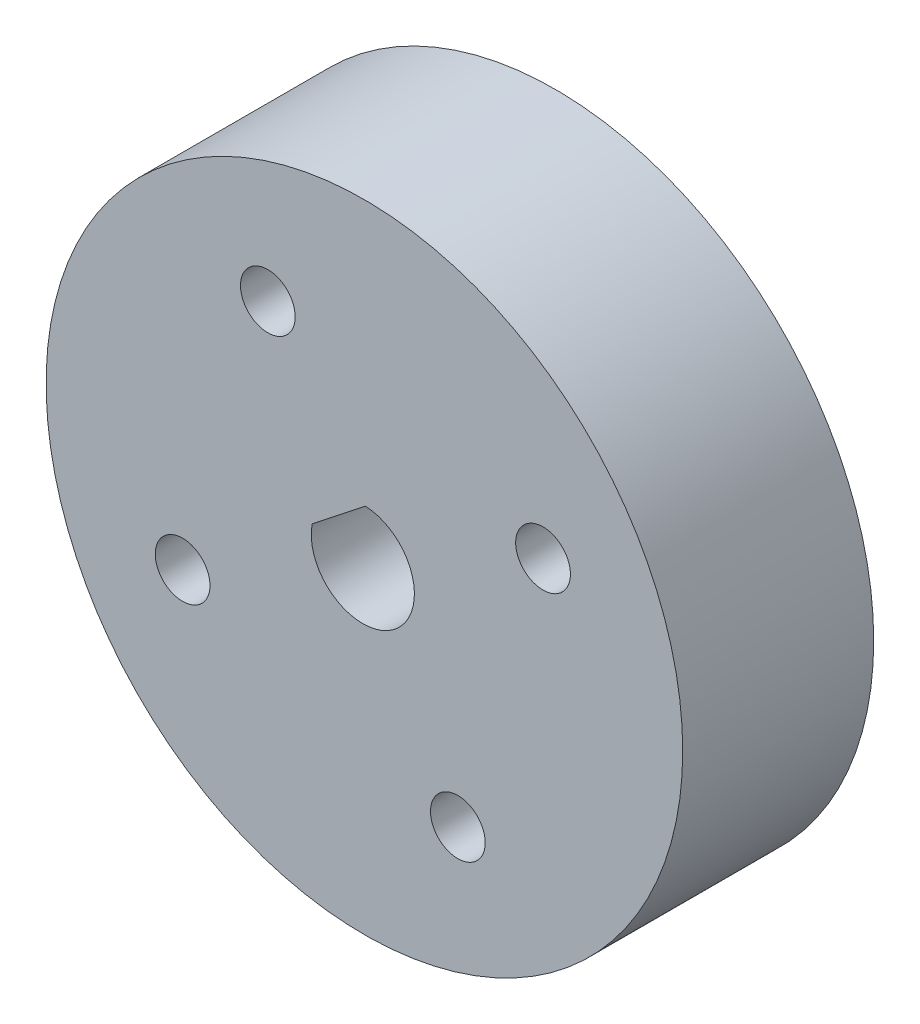
ISO-10303-21;
HEADER;
FILE_DESCRIPTION(('STEP AP214'),'2;1');
FILE_NAME('part.step','',(''),(''),'','','');
FILE_SCHEMA(('AUTOMOTIVE_DESIGN { 1 0 10303 214 1 1 1 1 }'));
ENDSEC;
DATA;
#1=APPLICATION_CONTEXT('core data for automotive mechanical design processes');
#2=APPLICATION_PROTOCOL_DEFINITION('international standard','automotive_design',2000,#1);
#3=PRODUCT_CONTEXT('',#1,'mechanical');
#4=PRODUCT('Part','Part','',(#3));
#5=PRODUCT_RELATED_PRODUCT_CATEGORY('part','',(#4));
#6=PRODUCT_DEFINITION_FORMATION('','',#4);
#7=PRODUCT_DEFINITION_CONTEXT('part definition',#1,'design');
#8=PRODUCT_DEFINITION('design','',#6,#7);
#9=PRODUCT_DEFINITION_SHAPE('','',#8);
#10=(LENGTH_UNIT() NAMED_UNIT(*) SI_UNIT(.MILLI.,.METRE.));
#11=(NAMED_UNIT(*) PLANE_ANGLE_UNIT() SI_UNIT($,.RADIAN.));
#12=(NAMED_UNIT(*) SI_UNIT($,.STERADIAN.) SOLID_ANGLE_UNIT());
#13=UNCERTAINTY_MEASURE_WITH_UNIT(LENGTH_MEASURE(1.E-05),#10,'distance_accuracy_value','');
#14=(GEOMETRIC_REPRESENTATION_CONTEXT(3) GLOBAL_UNCERTAINTY_ASSIGNED_CONTEXT((#13)) GLOBAL_UNIT_ASSIGNED_CONTEXT((#10,
#11,#12)) REPRESENTATION_CONTEXT('',''));
#15=CARTESIAN_POINT('',(0.,0.,0.));
#16=DIRECTION('',(0.,0.,1.));
#17=DIRECTION('',(1.,0.,0.));
#18=AXIS2_PLACEMENT_3D('',#15,#16,#17);
#19=CARTESIAN_POINT('',(0.,0.,15.));
#20=DIRECTION('',(0.,0.,-1.));
#21=DIRECTION('',(-1.,0.,0.));
#22=AXIS2_PLACEMENT_3D('',#19,#20,#21);
#23=CYLINDRICAL_SURFACE('',#22,25.);
#24=CARTESIAN_POINT('',(0.,0.,15.));
#25=DIRECTION('',(0.,0.,1.));
#26=DIRECTION('',(1.,0.,0.));
#27=AXIS2_PLACEMENT_3D('',#24,#25,#26);
#28=CIRCLE('',#27,25.);
#29=CARTESIAN_POINT('',(25.,0.,15.));
#30=VERTEX_POINT('',#29);
#31=EDGE_CURVE('E177',#30,#30,#28,.T.);
#32=ORIENTED_EDGE('',*,*,#31,.F.);
#33=EDGE_LOOP('',(#32));
#34=FACE_BOUND('',#33,.T.);
#35=CARTESIAN_POINT('',(0.,0.,0.));
#36=DIRECTION('',(0.,0.,1.));
#37=DIRECTION('',(1.,0.,0.));
#38=AXIS2_PLACEMENT_3D('',#35,#36,#37);
#39=CIRCLE('',#38,25.);
#40=CARTESIAN_POINT('',(25.,0.,0.));
#41=VERTEX_POINT('',#40);
#42=EDGE_CURVE('E181',#41,#41,#39,.T.);
#43=ORIENTED_EDGE('',*,*,#42,.T.);
#44=EDGE_LOOP('',(#43));
#45=FACE_BOUND('',#44,.T.);
#46=ADVANCED_FACE('F33',(#34,#45),#23,.T.);
#47=CARTESIAN_POINT('',(0.,0.,15.));
#48=DIRECTION('',(0.,0.,1.));
#49=DIRECTION('',(1.,0.,0.));
#50=AXIS2_PLACEMENT_3D('',#47,#48,#49);
#51=PLANE('',#50);
#52=DIRECTION('',(-0.785463081583808,-0.618908513004037,0.));
#53=VECTOR('',#52,1.);
#54=CARTESIAN_POINT('',(-2.00715081625987,2.54729549233499,15.));
#55=LINE('',#54,#53);
#56=CARTESIAN_POINT('',(0.0808079381687281,4.19251024299069,15.));
#57=VERTEX_POINT('',#56);
#58=CARTESIAN_POINT('',(-4.10505445468332,0.894244633899315,15.));
#59=VERTEX_POINT('',#58);
#60=EDGE_CURVE('E47',#57,#59,#55,.T.);
#61=ORIENTED_EDGE('',*,*,#60,.F.);
#62=CARTESIAN_POINT('',(-0.124452293595111,0.147715039615273,15.));
#63=DIRECTION('',(0.,0.,1.));
#64=DIRECTION('',(1.,0.,0.));
#65=AXIS2_PLACEMENT_3D('',#62,#63,#64);
#66=CIRCLE('',#65,4.05000000000025);
#67=EDGE_CURVE('E113',#59,#57,#66,.T.);
#68=ORIENTED_EDGE('',*,*,#67,.F.);
#69=EDGE_LOOP('',(#61,#68));
#70=FACE_BOUND('',#69,.T.);
#71=CARTESIAN_POINT('',(-14.2780397377677,-7.31391765438439,15.));
#72=DIRECTION('',(0.,0.,1.));
#73=DIRECTION('',(1.,0.,0.));
#74=AXIS2_PLACEMENT_3D('',#71,#72,#73);
#75=CIRCLE('',#74,2.14999999999999);
#76=CARTESIAN_POINT('',(-12.1280397377677,-7.31391765438439,15.));
#77=VERTEX_POINT('',#76);
#78=EDGE_CURVE('E126',#77,#77,#75,.T.);
#79=ORIENTED_EDGE('',*,*,#78,.F.);
#80=EDGE_LOOP('',(#79));
#81=FACE_BOUND('',#80,.T.);
#82=CARTESIAN_POINT('',(-7.58608498759472,14.3013024837877,15.));
#83=DIRECTION('',(0.,0.,1.));
#84=DIRECTION('',(1.,0.,0.));
#85=AXIS2_PLACEMENT_3D('',#82,#83,#84);
#86=CIRCLE('',#85,2.15);
#87=CARTESIAN_POINT('',(-5.43608498759472,14.3013024837877,15.));
#88=VERTEX_POINT('',#87);
#89=EDGE_CURVE('E132',#88,#88,#86,.T.);
#90=ORIENTED_EDGE('',*,*,#89,.F.);
#91=EDGE_LOOP('',(#90));
#92=FACE_BOUND('',#91,.T.);
#93=CARTESIAN_POINT('',(14.0291351505785,7.6093477336137,15.));
#94=DIRECTION('',(0.,0.,1.));
#95=DIRECTION('',(1.,0.,0.));
#96=AXIS2_PLACEMENT_3D('',#93,#94,#95);
#97=CIRCLE('',#96,2.15);
#98=CARTESIAN_POINT('',(16.1791351505785,7.6093477336137,15.));
#99=VERTEX_POINT('',#98);
#100=EDGE_CURVE('E138',#99,#99,#97,.T.);
#101=ORIENTED_EDGE('',*,*,#100,.F.);
#102=EDGE_LOOP('',(#101));
#103=FACE_BOUND('',#102,.T.);
#104=CARTESIAN_POINT('',(7.33718040040432,-14.0058724045571,15.));
#105=DIRECTION('',(0.,0.,1.));
#106=DIRECTION('',(1.,0.,0.));
#107=AXIS2_PLACEMENT_3D('',#104,#105,#106);
#108=CIRCLE('',#107,2.15);
#109=CARTESIAN_POINT('',(9.48718040040432,-14.0058724045571,15.));
#110=VERTEX_POINT('',#109);
#111=EDGE_CURVE('E109',#110,#110,#108,.T.);
#112=ORIENTED_EDGE('',*,*,#111,.F.);
#113=EDGE_LOOP('',(#112));
#114=FACE_BOUND('',#113,.T.);
#115=ORIENTED_EDGE('',*,*,#31,.T.);
#116=EDGE_LOOP('',(#115));
#117=FACE_BOUND('',#116,.T.);
#118=ADVANCED_FACE('F117',(#70,#81,#92,#103,#114,#117),#51,.T.);
#119=CARTESIAN_POINT('',(0.,0.,0.));
#120=DIRECTION('',(0.,0.,1.));
#121=DIRECTION('',(1.,0.,0.));
#122=AXIS2_PLACEMENT_3D('',#119,#120,#121);
#123=PLANE('',#122);
#124=CARTESIAN_POINT('',(0.,0.,0.));
#125=DIRECTION('',(0.,0.,-1.));
#126=DIRECTION('',(-1.,0.,0.));
#127=AXIS2_PLACEMENT_3D('',#124,#125,#126);
#128=CIRCLE('',#127,15.2);
#129=CARTESIAN_POINT('',(-15.2,0.,0.));
#130=VERTEX_POINT('',#129);
#131=EDGE_CURVE('E169',#130,#130,#128,.T.);
#132=ORIENTED_EDGE('',*,*,#131,.F.);
#133=EDGE_LOOP('',(#132));
#134=FACE_BOUND('',#133,.T.);
#135=ORIENTED_EDGE('',*,*,#42,.F.);
#136=EDGE_LOOP('',(#135));
#137=FACE_BOUND('',#136,.T.);
#138=ADVANCED_FACE('F240',(#134,#137),#123,.F.);
#139=CARTESIAN_POINT('',(0.,0.,8.));
#140=DIRECTION('',(0.,0.,-1.));
#141=DIRECTION('',(-1.,0.,0.));
#142=AXIS2_PLACEMENT_3D('',#139,#140,#141);
#143=CYLINDRICAL_SURFACE('',#142,15.2);
#144=CARTESIAN_POINT('',(0.,0.,8.));
#145=DIRECTION('',(0.,0.,-1.));
#146=DIRECTION('',(-1.,0.,0.));
#147=AXIS2_PLACEMENT_3D('',#144,#145,#146);
#148=CIRCLE('',#147,15.2);
#149=CARTESIAN_POINT('',(-14.2959150456976,-5.16399196418801,8.));
#150=VERTEX_POINT('',#149);
#151=CARTESIAN_POINT('',(-8.70121418309826,12.4631004063937,8.));
#152=VERTEX_POINT('',#151);
#153=EDGE_CURVE('E170',#150,#152,#148,.T.);
#154=ORIENTED_EDGE('',*,*,#153,.F.);
#155=DIRECTION('',(0.,0.,1.));
#156=VECTOR('',#155,1.);
#157=CARTESIAN_POINT('',(-14.2959150456976,-5.163991964188,10.));
#158=LINE('',#157,#156);
#159=CARTESIAN_POINT('',(-14.2959150456976,-5.16399196418801,5.));
#160=VERTEX_POINT('',#159);
#161=EDGE_CURVE('E166',#150,#160,#158,.F.);
#162=ORIENTED_EDGE('',*,*,#161,.T.);
#163=CARTESIAN_POINT('',(0.,0.,5.));
#164=DIRECTION('',(0.,0.,1.));
#165=DIRECTION('',(1.,0.,0.));
#166=AXIS2_PLACEMENT_3D('',#163,#164,#165);
#167=CIRCLE('',#166,15.2);
#168=CARTESIAN_POINT('',(-12.5437142660857,-8.58459273412545,5.));
#169=VERTEX_POINT('',#168);
#170=EDGE_CURVE('E197',#169,#160,#167,.F.);
#171=ORIENTED_EDGE('',*,*,#170,.F.);
#172=DIRECTION('',(0.,0.,1.));
#173=VECTOR('',#172,1.);
#174=CARTESIAN_POINT('',(-12.5437142660856,-8.58459273412544,10.));
#175=LINE('',#174,#173);
#176=CARTESIAN_POINT('',(-12.5437142660857,-8.58459273412544,8.));
#177=VERTEX_POINT('',#176);
#178=EDGE_CURVE('E163',#169,#177,#175,.T.);
#179=ORIENTED_EDGE('',*,*,#178,.T.);
#180=CARTESIAN_POINT('',(5.20486741347616,-14.2810838247009,8.));
#181=VERTEX_POINT('',#180);
#182=EDGE_CURVE('E173',#181,#177,#148,.T.);
#183=ORIENTED_EDGE('',*,*,#182,.F.);
#184=DIRECTION('',(0.,0.,1.));
#185=VECTOR('',#184,1.);
#186=CARTESIAN_POINT('',(5.20486741347617,-14.2810838247009,10.));
#187=LINE('',#186,#185);
#188=CARTESIAN_POINT('',(5.20486741347617,-14.2810838247009,5.));
#189=VERTEX_POINT('',#188);
#190=EDGE_CURVE('E148',#181,#189,#187,.F.);
#191=ORIENTED_EDGE('',*,*,#190,.T.);
#192=CARTESIAN_POINT('',(0.,0.,5.));
#193=DIRECTION('',(0.,0.,1.));
#194=DIRECTION('',(1.,0.,0.));
#195=AXIS2_PLACEMENT_3D('',#192,#193,#194);
#196=CIRCLE('',#195,15.2);
#197=CARTESIAN_POINT('',(8.77741229836268,-12.4095541154609,5.));
#198=VERTEX_POINT('',#197);
#199=EDGE_CURVE('E191',#198,#189,#196,.F.);
#200=ORIENTED_EDGE('',*,*,#199,.F.);
#201=DIRECTION('',(0.,0.,1.));
#202=VECTOR('',#201,1.);
#203=CARTESIAN_POINT('',(8.77741229836268,-12.4095541154609,10.));
#204=LINE('',#203,#202);
#205=CARTESIAN_POINT('',(8.77741229836269,-12.4095541154609,8.));
#206=VERTEX_POINT('',#205);
#207=EDGE_CURVE('E125',#198,#206,#204,.T.);
#208=ORIENTED_EDGE('',*,*,#207,.T.);
#209=CARTESIAN_POINT('',(14.1836109623299,5.46490439708465,8.));
#210=VERTEX_POINT('',#209);
#211=EDGE_CURVE('E271',#210,#206,#148,.T.);
#212=ORIENTED_EDGE('',*,*,#211,.F.);
#213=DIRECTION('',(0.,0.,1.));
#214=VECTOR('',#213,1.);
#215=CARTESIAN_POINT('',(14.1836109623299,5.46490439708467,10.));
#216=LINE('',#215,#214);
#217=CARTESIAN_POINT('',(14.1836109623299,5.46490439708467,5.));
#218=VERTEX_POINT('',#217);
#219=EDGE_CURVE('E154',#210,#218,#216,.F.);
#220=ORIENTED_EDGE('',*,*,#219,.T.);
#221=CARTESIAN_POINT('',(0.,0.,5.));
#222=DIRECTION('',(0.,0.,1.));
#223=DIRECTION('',(1.,0.,0.));
#224=AXIS2_PLACEMENT_3D('',#221,#222,#223);
#225=CIRCLE('',#224,15.2);
#226=CARTESIAN_POINT('',(12.3159096999612,8.90833139608098,5.));
#227=VERTEX_POINT('',#226);
#228=EDGE_CURVE('E193',#227,#218,#225,.F.);
#229=ORIENTED_EDGE('',*,*,#228,.F.);
#230=DIRECTION('',(0.,0.,1.));
#231=VECTOR('',#230,1.);
#232=CARTESIAN_POINT('',(12.3159096999612,8.90833139608098,10.));
#233=LINE('',#232,#231);
#234=CARTESIAN_POINT('',(12.3159096999612,8.90833139608099,8.));
#235=VERTEX_POINT('',#234);
#236=EDGE_CURVE('E151',#227,#235,#233,.T.);
#237=ORIENTED_EDGE('',*,*,#236,.T.);
#238=CARTESIAN_POINT('',(-5.43878189477274,14.1936482801672,8.));
#239=VERTEX_POINT('',#238);
#240=EDGE_CURVE('E174',#239,#235,#148,.T.);
#241=ORIENTED_EDGE('',*,*,#240,.F.);
#242=DIRECTION('',(0.,0.,1.));
#243=VECTOR('',#242,1.);
#244=CARTESIAN_POINT('',(-5.43878189477274,14.1936482801672,10.));
#245=LINE('',#244,#243);
#246=CARTESIAN_POINT('',(-5.43878189477274,14.1936482801672,5.));
#247=VERTEX_POINT('',#246);
#248=EDGE_CURVE('E160',#239,#247,#245,.F.);
#249=ORIENTED_EDGE('',*,*,#248,.T.);
#250=CARTESIAN_POINT('',(0.,0.,5.));
#251=DIRECTION('',(0.,0.,1.));
#252=DIRECTION('',(1.,0.,0.));
#253=AXIS2_PLACEMENT_3D('',#250,#251,#252);
#254=CIRCLE('',#253,15.2);
#255=CARTESIAN_POINT('',(-8.70121418309825,12.4631004063937,5.));
#256=VERTEX_POINT('',#255);
#257=EDGE_CURVE('E195',#256,#247,#254,.F.);
#258=ORIENTED_EDGE('',*,*,#257,.F.);
#259=DIRECTION('',(0.,0.,1.));
#260=VECTOR('',#259,1.);
#261=CARTESIAN_POINT('',(-8.70121418309825,12.4631004063937,10.));
#262=LINE('',#261,#260);
#263=EDGE_CURVE('E157',#256,#152,#262,.T.);
#264=ORIENTED_EDGE('',*,*,#263,.T.);
#265=EDGE_LOOP('',(#154,#162,#171,#179,#183,#191,#200,#208,#212,#220,#229,#237,#241,#249,#258,#264));
#266=FACE_BOUND('',#265,.T.);
#267=ORIENTED_EDGE('',*,*,#131,.T.);
#268=EDGE_LOOP('',(#267));
#269=FACE_BOUND('',#268,.T.);
#270=ADVANCED_FACE('F203',(#266,#269),#143,.F.);
#271=CARTESIAN_POINT('',(0.,0.,8.));
#272=DIRECTION('',(0.,0.,-1.));
#273=DIRECTION('',(-1.,0.,0.));
#274=AXIS2_PLACEMENT_3D('',#271,#272,#273);
#275=PLANE('',#274);
#276=DIRECTION('',(0.785463081583808,0.618908513004037,0.));
#277=VECTOR('',#276,1.);
#278=CARTESIAN_POINT('',(-2.00715081625987,2.54729549233499,8.));
#279=LINE('',#278,#277);
#280=CARTESIAN_POINT('',(-4.10505445468231,0.894244633899126,8.));
#281=VERTEX_POINT('',#280);
#282=CARTESIAN_POINT('',(0.0808079381687875,4.19251024299186,8.));
#283=VERTEX_POINT('',#282);
#284=EDGE_CURVE('E11',#281,#283,#279,.T.);
#285=ORIENTED_EDGE('',*,*,#284,.F.);
#286=CARTESIAN_POINT('',(-0.124452293595111,0.147715039615273,8.));
#287=DIRECTION('',(0.,0.,-1.));
#288=DIRECTION('',(-1.,0.,0.));
#289=AXIS2_PLACEMENT_3D('',#286,#287,#288);
#290=CIRCLE('',#289,4.05000000000025);
#291=EDGE_CURVE('E40',#283,#281,#290,.T.);
#292=ORIENTED_EDGE('',*,*,#291,.F.);
#293=EDGE_LOOP('',(#285,#292));
#294=FACE_BOUND('',#293,.T.);
#295=CARTESIAN_POINT('',(-14.2780397377677,-7.31391765438439,8.));
#296=DIRECTION('',(0.,0.,-1.));
#297=DIRECTION('',(-1.,0.,0.));
#298=AXIS2_PLACEMENT_3D('',#295,#296,#297);
#299=CIRCLE('',#298,2.14999999999999);
#300=EDGE_CURVE('E189',#150,#177,#299,.T.);
#301=ORIENTED_EDGE('',*,*,#300,.F.);
#302=ORIENTED_EDGE('',*,*,#153,.T.);
#303=CARTESIAN_POINT('',(-7.58608498759472,14.3013024837877,8.));
#304=DIRECTION('',(0.,0.,-1.));
#305=DIRECTION('',(-1.,0.,0.));
#306=AXIS2_PLACEMENT_3D('',#303,#304,#305);
#307=CIRCLE('',#306,2.15);
#308=EDGE_CURVE('E187',#239,#152,#307,.T.);
#309=ORIENTED_EDGE('',*,*,#308,.F.);
#310=ORIENTED_EDGE('',*,*,#240,.T.);
#311=CARTESIAN_POINT('',(14.0291351505785,7.6093477336137,8.));
#312=DIRECTION('',(0.,0.,-1.));
#313=DIRECTION('',(-1.,0.,0.));
#314=AXIS2_PLACEMENT_3D('',#311,#312,#313);
#315=CIRCLE('',#314,2.15);
#316=EDGE_CURVE('E185',#210,#235,#315,.T.);
#317=ORIENTED_EDGE('',*,*,#316,.F.);
#318=ORIENTED_EDGE('',*,*,#211,.T.);
#319=CARTESIAN_POINT('',(7.33718040040432,-14.0058724045571,8.));
#320=DIRECTION('',(0.,0.,-1.));
#321=DIRECTION('',(-1.,0.,0.));
#322=AXIS2_PLACEMENT_3D('',#319,#320,#321);
#323=CIRCLE('',#322,2.15);
#324=EDGE_CURVE('E180',#181,#206,#323,.T.);
#325=ORIENTED_EDGE('',*,*,#324,.F.);
#326=ORIENTED_EDGE('',*,*,#182,.T.);
#327=EDGE_LOOP('',(#301,#302,#309,#310,#317,#318,#325,#326));
#328=FACE_BOUND('',#327,.T.);
#329=ADVANCED_FACE('F199',(#294,#328),#275,.T.);
#330=CARTESIAN_POINT('',(7.33718040040432,-14.0058724045571,5.));
#331=DIRECTION('',(0.,0.,1.));
#332=DIRECTION('',(1.,0.,0.));
#333=AXIS2_PLACEMENT_3D('',#330,#331,#332);
#334=PLANE('',#333);
#335=ORIENTED_EDGE('',*,*,#199,.T.);
#336=CARTESIAN_POINT('',(7.33718040040432,-14.0058724045571,5.));
#337=DIRECTION('',(0.,0.,1.));
#338=DIRECTION('',(1.,0.,0.));
#339=AXIS2_PLACEMENT_3D('',#336,#337,#338);
#340=CIRCLE('',#339,2.15);
#341=EDGE_CURVE('E141',#189,#198,#340,.T.);
#342=ORIENTED_EDGE('',*,*,#341,.T.);
#343=EDGE_LOOP('',(#335,#342));
#344=FACE_BOUND('',#343,.T.);
#345=ADVANCED_FACE('F202',(#344),#334,.T.);
#346=CARTESIAN_POINT('',(7.33718040040432,-14.0058724045571,5.));
#347=DIRECTION('',(0.,0.,1.));
#348=DIRECTION('',(1.,0.,0.));
#349=AXIS2_PLACEMENT_3D('',#346,#347,#348);
#350=CYLINDRICAL_SURFACE('',#349,2.15);
#351=ORIENTED_EDGE('',*,*,#111,.T.);
#352=EDGE_LOOP('',(#351));
#353=FACE_BOUND('',#352,.T.);
#354=ORIENTED_EDGE('',*,*,#324,.T.);
#355=ORIENTED_EDGE('',*,*,#207,.F.);
#356=ORIENTED_EDGE('',*,*,#341,.F.);
#357=ORIENTED_EDGE('',*,*,#190,.F.);
#358=EDGE_LOOP('',(#354,#355,#356,#357));
#359=FACE_BOUND('',#358,.T.);
#360=ADVANCED_FACE('F254',(#353,#359),#350,.F.);
#361=CARTESIAN_POINT('',(14.0291351505785,7.6093477336137,5.));
#362=DIRECTION('',(0.,0.,1.));
#363=DIRECTION('',(1.,0.,0.));
#364=AXIS2_PLACEMENT_3D('',#361,#362,#363);
#365=PLANE('',#364);
#366=ORIENTED_EDGE('',*,*,#228,.T.);
#367=CARTESIAN_POINT('',(14.0291351505785,7.6093477336137,5.));
#368=DIRECTION('',(0.,0.,1.));
#369=DIRECTION('',(1.,0.,0.));
#370=AXIS2_PLACEMENT_3D('',#367,#368,#369);
#371=CIRCLE('',#370,2.15);
#372=EDGE_CURVE('E135',#218,#227,#371,.T.);
#373=ORIENTED_EDGE('',*,*,#372,.T.);
#374=EDGE_LOOP('',(#366,#373));
#375=FACE_BOUND('',#374,.T.);
#376=ADVANCED_FACE('F231',(#375),#365,.T.);
#377=CARTESIAN_POINT('',(14.0291351505785,7.6093477336137,5.));
#378=DIRECTION('',(0.,0.,1.));
#379=DIRECTION('',(1.,0.,0.));
#380=AXIS2_PLACEMENT_3D('',#377,#378,#379);
#381=CYLINDRICAL_SURFACE('',#380,2.15);
#382=ORIENTED_EDGE('',*,*,#100,.T.);
#383=EDGE_LOOP('',(#382));
#384=FACE_BOUND('',#383,.T.);
#385=ORIENTED_EDGE('',*,*,#316,.T.);
#386=ORIENTED_EDGE('',*,*,#236,.F.);
#387=ORIENTED_EDGE('',*,*,#372,.F.);
#388=ORIENTED_EDGE('',*,*,#219,.F.);
#389=EDGE_LOOP('',(#385,#386,#387,#388));
#390=FACE_BOUND('',#389,.T.);
#391=ADVANCED_FACE('F222',(#384,#390),#381,.F.);
#392=CARTESIAN_POINT('',(-7.58608498759472,14.3013024837877,5.));
#393=DIRECTION('',(0.,0.,1.));
#394=DIRECTION('',(1.,0.,0.));
#395=AXIS2_PLACEMENT_3D('',#392,#393,#394);
#396=PLANE('',#395);
#397=ORIENTED_EDGE('',*,*,#257,.T.);
#398=CARTESIAN_POINT('',(-7.58608498759472,14.3013024837877,5.));
#399=DIRECTION('',(0.,0.,1.));
#400=DIRECTION('',(1.,0.,0.));
#401=AXIS2_PLACEMENT_3D('',#398,#399,#400);
#402=CIRCLE('',#401,2.15);
#403=EDGE_CURVE('E129',#247,#256,#402,.T.);
#404=ORIENTED_EDGE('',*,*,#403,.T.);
#405=EDGE_LOOP('',(#397,#404));
#406=FACE_BOUND('',#405,.T.);
#407=ADVANCED_FACE('F220',(#406),#396,.T.);
#408=CARTESIAN_POINT('',(-7.58608498759472,14.3013024837877,5.));
#409=DIRECTION('',(0.,0.,1.));
#410=DIRECTION('',(1.,0.,0.));
#411=AXIS2_PLACEMENT_3D('',#408,#409,#410);
#412=CYLINDRICAL_SURFACE('',#411,2.15);
#413=ORIENTED_EDGE('',*,*,#89,.T.);
#414=EDGE_LOOP('',(#413));
#415=FACE_BOUND('',#414,.T.);
#416=ORIENTED_EDGE('',*,*,#308,.T.);
#417=ORIENTED_EDGE('',*,*,#263,.F.);
#418=ORIENTED_EDGE('',*,*,#403,.F.);
#419=ORIENTED_EDGE('',*,*,#248,.F.);
#420=EDGE_LOOP('',(#416,#417,#418,#419));
#421=FACE_BOUND('',#420,.T.);
#422=ADVANCED_FACE('F218',(#415,#421),#412,.F.);
#423=CARTESIAN_POINT('',(-14.2780397377677,-7.31391765438439,5.));
#424=DIRECTION('',(0.,0.,1.));
#425=DIRECTION('',(1.,0.,0.));
#426=AXIS2_PLACEMENT_3D('',#423,#424,#425);
#427=PLANE('',#426);
#428=ORIENTED_EDGE('',*,*,#170,.T.);
#429=CARTESIAN_POINT('',(-14.2780397377677,-7.31391765438439,5.));
#430=DIRECTION('',(0.,0.,1.));
#431=DIRECTION('',(1.,0.,0.));
#432=AXIS2_PLACEMENT_3D('',#429,#430,#431);
#433=CIRCLE('',#432,2.14999999999999);
#434=EDGE_CURVE('E122',#160,#169,#433,.T.);
#435=ORIENTED_EDGE('',*,*,#434,.T.);
#436=EDGE_LOOP('',(#428,#435));
#437=FACE_BOUND('',#436,.T.);
#438=ADVANCED_FACE('F228',(#437),#427,.T.);
#439=CARTESIAN_POINT('',(-14.2780397377677,-7.31391765438439,5.));
#440=DIRECTION('',(0.,0.,1.));
#441=DIRECTION('',(1.,0.,0.));
#442=AXIS2_PLACEMENT_3D('',#439,#440,#441);
#443=CYLINDRICAL_SURFACE('',#442,2.14999999999999);
#444=ORIENTED_EDGE('',*,*,#78,.T.);
#445=EDGE_LOOP('',(#444));
#446=FACE_BOUND('',#445,.T.);
#447=ORIENTED_EDGE('',*,*,#300,.T.);
#448=ORIENTED_EDGE('',*,*,#178,.F.);
#449=ORIENTED_EDGE('',*,*,#434,.F.);
#450=ORIENTED_EDGE('',*,*,#161,.F.);
#451=EDGE_LOOP('',(#447,#448,#449,#450));
#452=FACE_BOUND('',#451,.T.);
#453=ADVANCED_FACE('F277',(#446,#452),#443,.F.);
#454=CARTESIAN_POINT('',(-2.00715081625987,2.54729549233499,0.));
#455=DIRECTION('',(-0.618908513004037,0.785463081583808,0.));
#456=DIRECTION('',(-0.785463081583808,-0.618908513004037,0.));
#457=AXIS2_PLACEMENT_3D('',#454,#455,#456);
#458=PLANE('',#457);
#459=ORIENTED_EDGE('',*,*,#284,.T.);
#460=DIRECTION('',(0.,0.,1.));
#461=VECTOR('',#460,1.);
#462=CARTESIAN_POINT('',(0.0808079381687281,4.19251024299069,0.));
#463=LINE('',#462,#461);
#464=EDGE_CURVE('E54',#283,#57,#463,.T.);
#465=ORIENTED_EDGE('',*,*,#464,.T.);
#466=ORIENTED_EDGE('',*,*,#60,.T.);
#467=DIRECTION('',(0.,0.,1.));
#468=VECTOR('',#467,1.);
#469=CARTESIAN_POINT('',(-4.10505445468231,0.894244633899126,0.));
#470=LINE('',#469,#468);
#471=EDGE_CURVE('E110',#281,#59,#470,.T.);
#472=ORIENTED_EDGE('',*,*,#471,.F.);
#473=EDGE_LOOP('',(#459,#465,#466,#472));
#474=FACE_BOUND('',#473,.T.);
#475=ADVANCED_FACE('F106',(#474),#458,.F.);
#476=CARTESIAN_POINT('',(-0.124452293595111,0.147715039615273,0.));
#477=DIRECTION('',(0.,0.,1.));
#478=DIRECTION('',(1.,0.,0.));
#479=AXIS2_PLACEMENT_3D('',#476,#477,#478);
#480=CYLINDRICAL_SURFACE('',#479,4.05000000000025);
#481=ORIENTED_EDGE('',*,*,#291,.T.);
#482=ORIENTED_EDGE('',*,*,#471,.T.);
#483=ORIENTED_EDGE('',*,*,#67,.T.);
#484=ORIENTED_EDGE('',*,*,#464,.F.);
#485=EDGE_LOOP('',(#481,#482,#483,#484));
#486=FACE_BOUND('',#485,.T.);
#487=ADVANCED_FACE('F114',(#486),#480,.F.);
#488=CLOSED_SHELL('',(#46,#118,#138,#270,#329,#345,#360,#376,#391,#407,#422,#438,#453,#475,#487));
#489=MANIFOLD_SOLID_BREP('B2',#488);
#490=ADVANCED_BREP_SHAPE_REPRESENTATION('',(#18,#489),#14);
#491=SHAPE_DEFINITION_REPRESENTATION(#9,#490);
ENDSEC;
END-ISO-10303-21;
